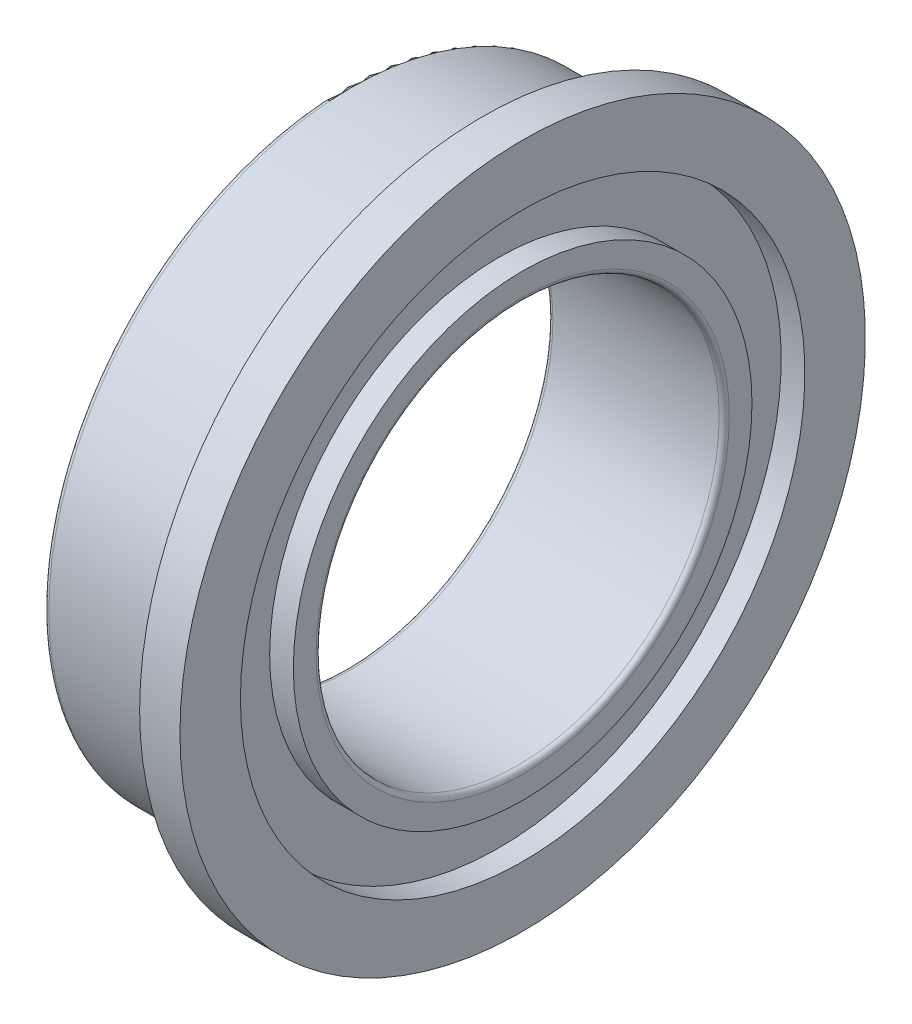
ISO-10303-21;
HEADER;
FILE_DESCRIPTION(('STEP AP214'),'2;1');
FILE_NAME('part.step','',(''),(''),'','','');
FILE_SCHEMA(('AUTOMOTIVE_DESIGN { 1 0 10303 214 1 1 1 1 }'));
ENDSEC;
DATA;
#1=APPLICATION_CONTEXT('core data for automotive mechanical design processes');
#2=APPLICATION_PROTOCOL_DEFINITION('international standard','automotive_design',2000,#1);
#3=PRODUCT_CONTEXT('',#1,'mechanical');
#4=PRODUCT('Part','Part','',(#3));
#5=PRODUCT_RELATED_PRODUCT_CATEGORY('part','',(#4));
#6=PRODUCT_DEFINITION_FORMATION('','',#4);
#7=PRODUCT_DEFINITION_CONTEXT('part definition',#1,'design');
#8=PRODUCT_DEFINITION('design','',#6,#7);
#9=PRODUCT_DEFINITION_SHAPE('','',#8);
#10=(LENGTH_UNIT() NAMED_UNIT(*) SI_UNIT(.MILLI.,.METRE.));
#11=(NAMED_UNIT(*) PLANE_ANGLE_UNIT() SI_UNIT($,.RADIAN.));
#12=(NAMED_UNIT(*) SI_UNIT($,.STERADIAN.) SOLID_ANGLE_UNIT());
#13=UNCERTAINTY_MEASURE_WITH_UNIT(LENGTH_MEASURE(1.E-05),#10,'distance_accuracy_value','');
#14=(GEOMETRIC_REPRESENTATION_CONTEXT(3) GLOBAL_UNCERTAINTY_ASSIGNED_CONTEXT((#13)) GLOBAL_UNIT_ASSIGNED_CONTEXT((#10,
#11,#12)) REPRESENTATION_CONTEXT('',''));
#15=CARTESIAN_POINT('',(0.,0.,0.));
#16=DIRECTION('',(0.,0.,1.));
#17=DIRECTION('',(1.,0.,0.));
#18=AXIS2_PLACEMENT_3D('',#15,#16,#17);
#19=CARTESIAN_POINT('',(-2.7,0.,0.));
#20=DIRECTION('',(-1.,0.,0.));
#21=DIRECTION('',(0.,0.,1.));
#22=AXIS2_PLACEMENT_3D('',#19,#20,#21);
#23=CYLINDRICAL_SURFACE('',#22,6.8);
#24=CARTESIAN_POINT('',(0.,0.,0.));
#25=DIRECTION('',(-1.,0.,0.));
#26=DIRECTION('',(0.,0.,1.));
#27=AXIS2_PLACEMENT_3D('',#24,#25,#26);
#28=CIRCLE('',#27,6.8);
#29=CARTESIAN_POINT('',(0.,0.,6.8));
#30=VERTEX_POINT('',#29);
#31=EDGE_CURVE('E74',#30,#30,#28,.T.);
#32=ORIENTED_EDGE('',*,*,#31,.F.);
#33=EDGE_LOOP('',(#32));
#34=FACE_BOUND('',#33,.T.);
#35=CARTESIAN_POINT('',(0.8,0.,0.));
#36=DIRECTION('',(-1.,0.,0.));
#37=DIRECTION('',(0.,0.,1.));
#38=AXIS2_PLACEMENT_3D('',#35,#36,#37);
#39=CIRCLE('',#38,6.8);
#40=CARTESIAN_POINT('',(0.8,0.,6.8));
#41=VERTEX_POINT('',#40);
#42=EDGE_CURVE('E118',#41,#41,#39,.T.);
#43=ORIENTED_EDGE('',*,*,#42,.T.);
#44=EDGE_LOOP('',(#43));
#45=FACE_BOUND('',#44,.T.);
#46=ADVANCED_FACE('F40',(#34,#45),#23,.T.);
#47=CARTESIAN_POINT('',(0.,6.2,0.));
#48=DIRECTION('',(1.,0.,0.));
#49=DIRECTION('',(0.,0.,-1.));
#50=AXIS2_PLACEMENT_3D('',#47,#48,#49);
#51=PLANE('',#50);
#52=CARTESIAN_POINT('',(0.,0.,0.));
#53=DIRECTION('',(-1.,0.,0.));
#54=DIRECTION('',(0.,0.,1.));
#55=AXIS2_PLACEMENT_3D('',#52,#53,#54);
#56=CIRCLE('',#55,6.2);
#57=CARTESIAN_POINT('',(0.,0.,6.2));
#58=VERTEX_POINT('',#57);
#59=EDGE_CURVE('E78',#58,#58,#56,.T.);
#60=ORIENTED_EDGE('',*,*,#59,.F.);
#61=EDGE_LOOP('',(#60));
#62=FACE_BOUND('',#61,.T.);
#63=ORIENTED_EDGE('',*,*,#31,.T.);
#64=EDGE_LOOP('',(#63));
#65=FACE_BOUND('',#64,.T.);
#66=ADVANCED_FACE('F162',(#62,#65),#51,.F.);
#67=CARTESIAN_POINT('',(0.,0.,0.));
#68=DIRECTION('',(-1.,0.,0.));
#69=DIRECTION('',(0.,0.,1.));
#70=AXIS2_PLACEMENT_3D('',#67,#68,#69);
#71=TOROIDAL_SURFACE('',#70,6.,0.2);
#72=CARTESIAN_POINT('',(-0.2,0.,0.));
#73=DIRECTION('',(-1.,0.,0.));
#74=DIRECTION('',(0.,0.,1.));
#75=AXIS2_PLACEMENT_3D('',#72,#73,#74);
#76=CIRCLE('',#75,6.);
#77=CARTESIAN_POINT('',(-0.2,0.,6.));
#78=VERTEX_POINT('',#77);
#79=EDGE_CURVE('E82',#78,#78,#76,.T.);
#80=ORIENTED_EDGE('',*,*,#79,.F.);
#81=EDGE_LOOP('',(#80));
#82=FACE_BOUND('',#81,.T.);
#83=ORIENTED_EDGE('',*,*,#59,.T.);
#84=EDGE_LOOP('',(#83));
#85=FACE_BOUND('',#84,.T.);
#86=ADVANCED_FACE('F168',(#82,#85),#71,.F.);
#87=CARTESIAN_POINT('',(-2.7,0.,0.));
#88=DIRECTION('',(-1.,0.,0.));
#89=DIRECTION('',(0.,0.,1.));
#90=AXIS2_PLACEMENT_3D('',#87,#88,#89);
#91=CYLINDRICAL_SURFACE('',#90,6.);
#92=CARTESIAN_POINT('',(-2.6,0.,0.));
#93=DIRECTION('',(1.,0.,0.));
#94=DIRECTION('',(0.,0.,-1.));
#95=AXIS2_PLACEMENT_3D('',#92,#93,#94);
#96=CIRCLE('',#95,6.);
#97=CARTESIAN_POINT('',(-2.6,0.,-6.));
#98=VERTEX_POINT('',#97);
#99=EDGE_CURVE('E10',#98,#98,#96,.T.);
#100=ORIENTED_EDGE('',*,*,#99,.T.);
#101=EDGE_LOOP('',(#100));
#102=FACE_BOUND('',#101,.T.);
#103=ORIENTED_EDGE('',*,*,#79,.T.);
#104=EDGE_LOOP('',(#103));
#105=FACE_BOUND('',#104,.T.);
#106=ADVANCED_FACE('F213',(#102,#105),#91,.T.);
#107=CARTESIAN_POINT('',(-2.7,5.6,0.));
#108=DIRECTION('',(1.,0.,0.));
#109=DIRECTION('',(0.,0.,-1.));
#110=AXIS2_PLACEMENT_3D('',#107,#108,#109);
#111=PLANE('',#110);
#112=CARTESIAN_POINT('',(-2.7,0.,0.));
#113=DIRECTION('',(1.,0.,0.));
#114=DIRECTION('',(0.,0.,-1.));
#115=AXIS2_PLACEMENT_3D('',#112,#113,#114);
#116=CIRCLE('',#115,5.9);
#117=CARTESIAN_POINT('',(-2.7,0.,-5.9));
#118=VERTEX_POINT('',#117);
#119=EDGE_CURVE('E48',#118,#118,#116,.F.);
#120=ORIENTED_EDGE('',*,*,#119,.T.);
#121=EDGE_LOOP('',(#120));
#122=FACE_BOUND('',#121,.T.);
#123=CARTESIAN_POINT('',(-2.7,0.,0.));
#124=DIRECTION('',(-1.,0.,0.));
#125=DIRECTION('',(0.,0.,1.));
#126=AXIS2_PLACEMENT_3D('',#123,#124,#125);
#127=CIRCLE('',#126,5.6);
#128=CARTESIAN_POINT('',(-2.7,0.,5.6));
#129=VERTEX_POINT('',#128);
#130=EDGE_CURVE('E86',#129,#129,#127,.T.);
#131=ORIENTED_EDGE('',*,*,#130,.F.);
#132=EDGE_LOOP('',(#131));
#133=FACE_BOUND('',#132,.T.);
#134=ADVANCED_FACE('F208',(#122,#133),#111,.F.);
#135=CARTESIAN_POINT('',(-2.7,0.,0.));
#136=DIRECTION('',(-1.,0.,0.));
#137=DIRECTION('',(0.,0.,1.));
#138=AXIS2_PLACEMENT_3D('',#135,#136,#137);
#139=CYLINDRICAL_SURFACE('',#138,5.6);
#140=CARTESIAN_POINT('',(-2.23,0.,0.));
#141=DIRECTION('',(-1.,0.,0.));
#142=DIRECTION('',(0.,0.,1.));
#143=AXIS2_PLACEMENT_3D('',#140,#141,#142);
#144=CIRCLE('',#143,5.6);
#145=CARTESIAN_POINT('',(-2.23,0.,5.6));
#146=VERTEX_POINT('',#145);
#147=EDGE_CURVE('E90',#146,#146,#144,.T.);
#148=ORIENTED_EDGE('',*,*,#147,.F.);
#149=EDGE_LOOP('',(#148));
#150=FACE_BOUND('',#149,.T.);
#151=ORIENTED_EDGE('',*,*,#130,.T.);
#152=EDGE_LOOP('',(#151));
#153=FACE_BOUND('',#152,.T.);
#154=ADVANCED_FACE('F202',(#150,#153),#139,.F.);
#155=CARTESIAN_POINT('',(-2.23,5.6,0.));
#156=DIRECTION('',(1.,0.,0.));
#157=DIRECTION('',(0.,0.,-1.));
#158=AXIS2_PLACEMENT_3D('',#155,#156,#157);
#159=PLANE('',#158);
#160=CARTESIAN_POINT('',(-2.23,0.,0.));
#161=DIRECTION('',(-1.,0.,0.));
#162=DIRECTION('',(0.,0.,1.));
#163=AXIS2_PLACEMENT_3D('',#160,#161,#162);
#164=CIRCLE('',#163,4.55);
#165=CARTESIAN_POINT('',(-2.23,0.,4.55));
#166=VERTEX_POINT('',#165);
#167=EDGE_CURVE('E94',#166,#166,#164,.T.);
#168=ORIENTED_EDGE('',*,*,#167,.F.);
#169=EDGE_LOOP('',(#168));
#170=FACE_BOUND('',#169,.T.);
#171=ORIENTED_EDGE('',*,*,#147,.T.);
#172=EDGE_LOOP('',(#171));
#173=FACE_BOUND('',#172,.T.);
#174=ADVANCED_FACE('F196',(#170,#173),#159,.F.);
#175=CARTESIAN_POINT('',(-2.7,0.,0.));
#176=DIRECTION('',(-1.,0.,0.));
#177=DIRECTION('',(0.,0.,1.));
#178=AXIS2_PLACEMENT_3D('',#175,#176,#177);
#179=CYLINDRICAL_SURFACE('',#178,4.55);
#180=CARTESIAN_POINT('',(-2.7,0.,0.));
#181=DIRECTION('',(-1.,0.,0.));
#182=DIRECTION('',(0.,0.,1.));
#183=AXIS2_PLACEMENT_3D('',#180,#181,#182);
#184=CIRCLE('',#183,4.55);
#185=CARTESIAN_POINT('',(-2.7,0.,4.55));
#186=VERTEX_POINT('',#185);
#187=EDGE_CURVE('E98',#186,#186,#184,.T.);
#188=ORIENTED_EDGE('',*,*,#187,.F.);
#189=EDGE_LOOP('',(#188));
#190=FACE_BOUND('',#189,.T.);
#191=ORIENTED_EDGE('',*,*,#167,.T.);
#192=EDGE_LOOP('',(#191));
#193=FACE_BOUND('',#192,.T.);
#194=ADVANCED_FACE('F190',(#190,#193),#179,.T.);
#195=CARTESIAN_POINT('',(-2.7,4.,0.));
#196=DIRECTION('',(1.,0.,0.));
#197=DIRECTION('',(0.,0.,-1.));
#198=AXIS2_PLACEMENT_3D('',#195,#196,#197);
#199=PLANE('',#198);
#200=CARTESIAN_POINT('',(-2.7,0.,0.));
#201=DIRECTION('',(1.,0.,0.));
#202=DIRECTION('',(0.,0.,-1.));
#203=AXIS2_PLACEMENT_3D('',#200,#201,#202);
#204=CIRCLE('',#203,4.1);
#205=CARTESIAN_POINT('',(-2.7,0.,-4.1));
#206=VERTEX_POINT('',#205);
#207=EDGE_CURVE('E54',#206,#206,#204,.T.);
#208=ORIENTED_EDGE('',*,*,#207,.T.);
#209=EDGE_LOOP('',(#208));
#210=FACE_BOUND('',#209,.T.);
#211=ORIENTED_EDGE('',*,*,#187,.T.);
#212=EDGE_LOOP('',(#211));
#213=FACE_BOUND('',#212,.T.);
#214=ADVANCED_FACE('F158',(#210,#213),#199,.F.);
#215=CARTESIAN_POINT('',(-2.7,0.,0.));
#216=DIRECTION('',(-1.,0.,0.));
#217=DIRECTION('',(0.,0.,1.));
#218=AXIS2_PLACEMENT_3D('',#215,#216,#217);
#219=CYLINDRICAL_SURFACE('',#218,4.);
#220=CARTESIAN_POINT('',(0.7,0.,0.));
#221=DIRECTION('',(-1.,0.,0.));
#222=DIRECTION('',(0.,0.,1.));
#223=AXIS2_PLACEMENT_3D('',#220,#221,#222);
#224=CIRCLE('',#223,4.);
#225=CARTESIAN_POINT('',(0.7,0.,4.));
#226=VERTEX_POINT('',#225);
#227=EDGE_CURVE('E60',#226,#226,#224,.F.);
#228=ORIENTED_EDGE('',*,*,#227,.T.);
#229=EDGE_LOOP('',(#228));
#230=FACE_BOUND('',#229,.T.);
#231=CARTESIAN_POINT('',(-2.6,0.,0.));
#232=DIRECTION('',(1.,0.,0.));
#233=DIRECTION('',(0.,0.,-1.));
#234=AXIS2_PLACEMENT_3D('',#231,#232,#233);
#235=CIRCLE('',#234,4.);
#236=CARTESIAN_POINT('',(-2.6,0.,-4.));
#237=VERTEX_POINT('',#236);
#238=EDGE_CURVE('E66',#237,#237,#235,.F.);
#239=ORIENTED_EDGE('',*,*,#238,.T.);
#240=EDGE_LOOP('',(#239));
#241=FACE_BOUND('',#240,.T.);
#242=ADVANCED_FACE('F152',(#230,#241),#219,.F.);
#243=CARTESIAN_POINT('',(0.8,4.55,0.));
#244=DIRECTION('',(-1.,0.,0.));
#245=DIRECTION('',(0.,0.,1.));
#246=AXIS2_PLACEMENT_3D('',#243,#244,#245);
#247=PLANE('',#246);
#248=CARTESIAN_POINT('',(0.8,0.,0.));
#249=DIRECTION('',(-1.,0.,0.));
#250=DIRECTION('',(0.,0.,1.));
#251=AXIS2_PLACEMENT_3D('',#248,#249,#250);
#252=CIRCLE('',#251,4.1);
#253=CARTESIAN_POINT('',(0.8,0.,4.1));
#254=VERTEX_POINT('',#253);
#255=EDGE_CURVE('E70',#254,#254,#252,.T.);
#256=ORIENTED_EDGE('',*,*,#255,.T.);
#257=EDGE_LOOP('',(#256));
#258=FACE_BOUND('',#257,.T.);
#259=CARTESIAN_POINT('',(0.8,0.,0.));
#260=DIRECTION('',(-1.,0.,0.));
#261=DIRECTION('',(0.,0.,1.));
#262=AXIS2_PLACEMENT_3D('',#259,#260,#261);
#263=CIRCLE('',#262,4.55);
#264=CARTESIAN_POINT('',(0.8,0.,4.55));
#265=VERTEX_POINT('',#264);
#266=EDGE_CURVE('E102',#265,#265,#263,.T.);
#267=ORIENTED_EDGE('',*,*,#266,.F.);
#268=EDGE_LOOP('',(#267));
#269=FACE_BOUND('',#268,.T.);
#270=ADVANCED_FACE('F147',(#258,#269),#247,.F.);
#271=CARTESIAN_POINT('',(-2.7,0.,0.));
#272=DIRECTION('',(-1.,0.,0.));
#273=DIRECTION('',(0.,0.,1.));
#274=AXIS2_PLACEMENT_3D('',#271,#272,#273);
#275=CYLINDRICAL_SURFACE('',#274,4.55);
#276=CARTESIAN_POINT('',(0.33,0.,0.));
#277=DIRECTION('',(-1.,0.,0.));
#278=DIRECTION('',(0.,0.,1.));
#279=AXIS2_PLACEMENT_3D('',#276,#277,#278);
#280=CIRCLE('',#279,4.55);
#281=CARTESIAN_POINT('',(0.33,0.,4.55));
#282=VERTEX_POINT('',#281);
#283=EDGE_CURVE('E106',#282,#282,#280,.T.);
#284=ORIENTED_EDGE('',*,*,#283,.F.);
#285=EDGE_LOOP('',(#284));
#286=FACE_BOUND('',#285,.T.);
#287=ORIENTED_EDGE('',*,*,#266,.T.);
#288=EDGE_LOOP('',(#287));
#289=FACE_BOUND('',#288,.T.);
#290=ADVANCED_FACE('F141',(#286,#289),#275,.T.);
#291=CARTESIAN_POINT('',(0.33,5.6,0.));
#292=DIRECTION('',(-1.,0.,0.));
#293=DIRECTION('',(0.,0.,1.));
#294=AXIS2_PLACEMENT_3D('',#291,#292,#293);
#295=PLANE('',#294);
#296=CARTESIAN_POINT('',(0.33,0.,0.));
#297=DIRECTION('',(-1.,0.,0.));
#298=DIRECTION('',(0.,0.,1.));
#299=AXIS2_PLACEMENT_3D('',#296,#297,#298);
#300=CIRCLE('',#299,5.6);
#301=CARTESIAN_POINT('',(0.33,0.,5.6));
#302=VERTEX_POINT('',#301);
#303=EDGE_CURVE('E110',#302,#302,#300,.T.);
#304=ORIENTED_EDGE('',*,*,#303,.F.);
#305=EDGE_LOOP('',(#304));
#306=FACE_BOUND('',#305,.T.);
#307=ORIENTED_EDGE('',*,*,#283,.T.);
#308=EDGE_LOOP('',(#307));
#309=FACE_BOUND('',#308,.T.);
#310=ADVANCED_FACE('F135',(#306,#309),#295,.F.);
#311=CARTESIAN_POINT('',(-2.7,0.,0.));
#312=DIRECTION('',(-1.,0.,0.));
#313=DIRECTION('',(0.,0.,1.));
#314=AXIS2_PLACEMENT_3D('',#311,#312,#313);
#315=CYLINDRICAL_SURFACE('',#314,5.6);
#316=CARTESIAN_POINT('',(0.8,0.,0.));
#317=DIRECTION('',(-1.,0.,0.));
#318=DIRECTION('',(0.,0.,1.));
#319=AXIS2_PLACEMENT_3D('',#316,#317,#318);
#320=CIRCLE('',#319,5.6);
#321=CARTESIAN_POINT('',(0.8,0.,5.6));
#322=VERTEX_POINT('',#321);
#323=EDGE_CURVE('E114',#322,#322,#320,.T.);
#324=ORIENTED_EDGE('',*,*,#323,.F.);
#325=EDGE_LOOP('',(#324));
#326=FACE_BOUND('',#325,.T.);
#327=ORIENTED_EDGE('',*,*,#303,.T.);
#328=EDGE_LOOP('',(#327));
#329=FACE_BOUND('',#328,.T.);
#330=ADVANCED_FACE('F129',(#326,#329),#315,.F.);
#331=CARTESIAN_POINT('',(0.8,6.8,0.));
#332=DIRECTION('',(-1.,0.,0.));
#333=DIRECTION('',(0.,0.,1.));
#334=AXIS2_PLACEMENT_3D('',#331,#332,#333);
#335=PLANE('',#334);
#336=ORIENTED_EDGE('',*,*,#42,.F.);
#337=EDGE_LOOP('',(#336));
#338=FACE_BOUND('',#337,.T.);
#339=ORIENTED_EDGE('',*,*,#323,.T.);
#340=EDGE_LOOP('',(#339));
#341=FACE_BOUND('',#340,.T.);
#342=ADVANCED_FACE('F125',(#338,#341),#335,.F.);
#343=CARTESIAN_POINT('',(0.7,0.,0.));
#344=DIRECTION('',(-1.,0.,0.));
#345=DIRECTION('',(0.,0.,1.));
#346=AXIS2_PLACEMENT_3D('',#343,#344,#345);
#347=TOROIDAL_SURFACE('',#346,4.1,0.1);
#348=ORIENTED_EDGE('',*,*,#227,.F.);
#349=EDGE_LOOP('',(#348));
#350=FACE_BOUND('',#349,.T.);
#351=ORIENTED_EDGE('',*,*,#255,.F.);
#352=EDGE_LOOP('',(#351));
#353=FACE_BOUND('',#352,.T.);
#354=ADVANCED_FACE('F128',(#350,#353),#347,.T.);
#355=CARTESIAN_POINT('',(-2.6,0.,0.));
#356=DIRECTION('',(1.,0.,0.));
#357=DIRECTION('',(0.,0.,-1.));
#358=AXIS2_PLACEMENT_3D('',#355,#356,#357);
#359=TOROIDAL_SURFACE('',#358,4.1,0.1);
#360=ORIENTED_EDGE('',*,*,#207,.F.);
#361=EDGE_LOOP('',(#360));
#362=FACE_BOUND('',#361,.T.);
#363=ORIENTED_EDGE('',*,*,#238,.F.);
#364=EDGE_LOOP('',(#363));
#365=FACE_BOUND('',#364,.T.);
#366=ADVANCED_FACE('F175',(#362,#365),#359,.T.);
#367=CARTESIAN_POINT('',(-2.6,0.,0.));
#368=DIRECTION('',(1.,0.,0.));
#369=DIRECTION('',(0.,0.,-1.));
#370=AXIS2_PLACEMENT_3D('',#367,#368,#369);
#371=TOROIDAL_SURFACE('',#370,5.9,0.1);
#372=ORIENTED_EDGE('',*,*,#99,.F.);
#373=EDGE_LOOP('',(#372));
#374=FACE_BOUND('',#373,.T.);
#375=ORIENTED_EDGE('',*,*,#119,.F.);
#376=EDGE_LOOP('',(#375));
#377=FACE_BOUND('',#376,.T.);
#378=ADVANCED_FACE('F42',(#374,#377),#371,.T.);
#379=CLOSED_SHELL('',(#46,#66,#86,#106,#134,#154,#174,#194,#214,#242,#270,#290,#310,#330,#342,
#354,#366,#378));
#380=MANIFOLD_SOLID_BREP('B2',#379);
#381=ADVANCED_BREP_SHAPE_REPRESENTATION('',(#18,#380),#14);
#382=SHAPE_DEFINITION_REPRESENTATION(#9,#381);
ENDSEC;
END-ISO-10303-21;
